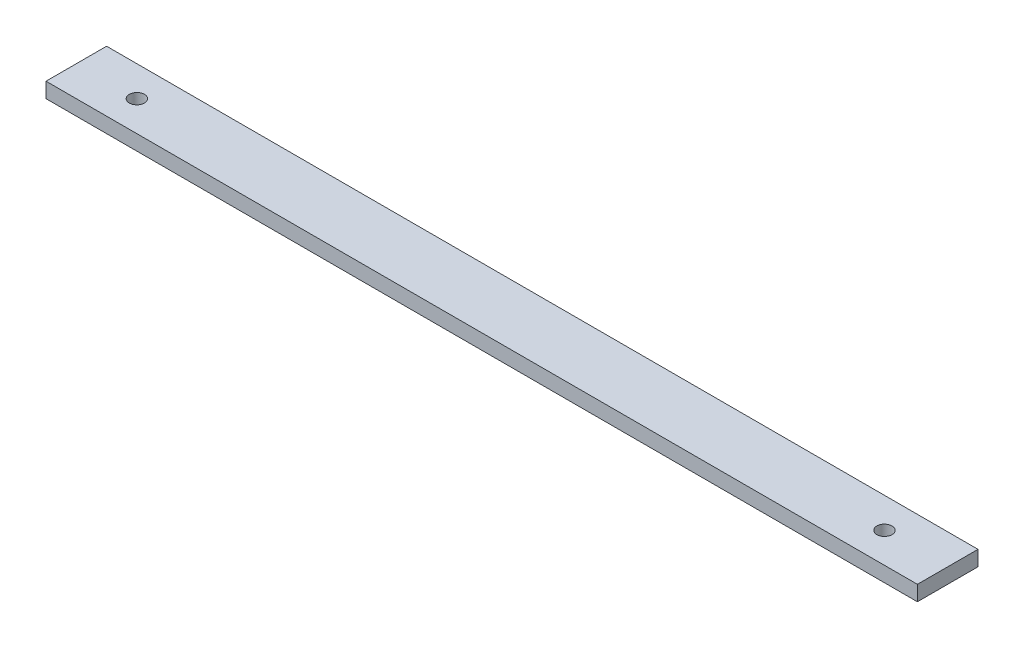
ISO-10303-21;
HEADER;
FILE_DESCRIPTION(('STEP AP214'),'2;1');
FILE_NAME('part.step','',(''),(''),'','','');
FILE_SCHEMA(('AUTOMOTIVE_DESIGN { 1 0 10303 214 1 1 1 1 }'));
ENDSEC;
DATA;
#1=APPLICATION_CONTEXT('core data for automotive mechanical design processes');
#2=APPLICATION_PROTOCOL_DEFINITION('international standard','automotive_design',2000,#1);
#3=PRODUCT_CONTEXT('',#1,'mechanical');
#4=PRODUCT('Part','Part','',(#3));
#5=PRODUCT_RELATED_PRODUCT_CATEGORY('part','',(#4));
#6=PRODUCT_DEFINITION_FORMATION('','',#4);
#7=PRODUCT_DEFINITION_CONTEXT('part definition',#1,'design');
#8=PRODUCT_DEFINITION('design','',#6,#7);
#9=PRODUCT_DEFINITION_SHAPE('','',#8);
#10=(LENGTH_UNIT() NAMED_UNIT(*) SI_UNIT(.MILLI.,.METRE.));
#11=(NAMED_UNIT(*) PLANE_ANGLE_UNIT() SI_UNIT($,.RADIAN.));
#12=(NAMED_UNIT(*) SI_UNIT($,.STERADIAN.) SOLID_ANGLE_UNIT());
#13=UNCERTAINTY_MEASURE_WITH_UNIT(LENGTH_MEASURE(1.E-05),#10,'distance_accuracy_value','');
#14=(GEOMETRIC_REPRESENTATION_CONTEXT(3) GLOBAL_UNCERTAINTY_ASSIGNED_CONTEXT((#13)) GLOBAL_UNIT_ASSIGNED_CONTEXT((#10,
#11,#12)) REPRESENTATION_CONTEXT('',''));
#15=CARTESIAN_POINT('',(0.,0.,0.));
#16=DIRECTION('',(0.,0.,1.));
#17=DIRECTION('',(1.,0.,0.));
#18=AXIS2_PLACEMENT_3D('',#15,#16,#17);
#19=CARTESIAN_POINT('',(0.,6.35,0.));
#20=DIRECTION('',(1.,0.,0.));
#21=DIRECTION('',(0.,0.,-1.));
#22=AXIS2_PLACEMENT_3D('',#19,#20,#21);
#23=PLANE('',#22);
#24=DIRECTION('',(0.,0.,1.));
#25=VECTOR('',#24,1.);
#26=CARTESIAN_POINT('',(0.,0.,0.));
#27=LINE('',#26,#25);
#28=CARTESIAN_POINT('',(0.,0.,0.));
#29=VERTEX_POINT('',#28);
#30=CARTESIAN_POINT('',(0.,0.,25.4));
#31=VERTEX_POINT('',#30);
#32=EDGE_CURVE('E96',#29,#31,#27,.T.);
#33=ORIENTED_EDGE('',*,*,#32,.T.);
#34=DIRECTION('',(0.,-1.,0.));
#35=VECTOR('',#34,1.);
#36=CARTESIAN_POINT('',(0.,6.35,25.4));
#37=LINE('',#36,#35);
#38=CARTESIAN_POINT('',(0.,6.35,25.4));
#39=VERTEX_POINT('',#38);
#40=EDGE_CURVE('E11',#39,#31,#37,.T.);
#41=ORIENTED_EDGE('',*,*,#40,.F.);
#42=DIRECTION('',(0.,0.,1.));
#43=VECTOR('',#42,1.);
#44=CARTESIAN_POINT('',(0.,6.35,0.));
#45=LINE('',#44,#43);
#46=CARTESIAN_POINT('',(0.,6.35,0.));
#47=VERTEX_POINT('',#46);
#48=EDGE_CURVE('E84',#47,#39,#45,.T.);
#49=ORIENTED_EDGE('',*,*,#48,.F.);
#50=DIRECTION('',(0.,-1.,0.));
#51=VECTOR('',#50,1.);
#52=CARTESIAN_POINT('',(0.,6.35,0.));
#53=LINE('',#52,#51);
#54=EDGE_CURVE('E92',#47,#29,#53,.T.);
#55=ORIENTED_EDGE('',*,*,#54,.T.);
#56=EDGE_LOOP('',(#33,#41,#49,#55));
#57=FACE_BOUND('',#56,.T.);
#58=ADVANCED_FACE('F33',(#57),#23,.F.);
#59=CARTESIAN_POINT('',(0.,6.35,25.4));
#60=DIRECTION('',(0.,0.,-1.));
#61=DIRECTION('',(-1.,0.,0.));
#62=AXIS2_PLACEMENT_3D('',#59,#60,#61);
#63=PLANE('',#62);
#64=DIRECTION('',(1.,0.,0.));
#65=VECTOR('',#64,1.);
#66=CARTESIAN_POINT('',(0.,0.,25.4));
#67=LINE('',#66,#65);
#68=CARTESIAN_POINT('',(365.252,0.,25.4));
#69=VERTEX_POINT('',#68);
#70=EDGE_CURVE('E88',#31,#69,#67,.T.);
#71=ORIENTED_EDGE('',*,*,#70,.T.);
#72=DIRECTION('',(0.,-1.,0.));
#73=VECTOR('',#72,1.);
#74=CARTESIAN_POINT('',(365.252,6.35,25.4));
#75=LINE('',#74,#73);
#76=CARTESIAN_POINT('',(365.252,6.35,25.4));
#77=VERTEX_POINT('',#76);
#78=EDGE_CURVE('E41',#77,#69,#75,.T.);
#79=ORIENTED_EDGE('',*,*,#78,.F.);
#80=DIRECTION('',(1.,0.,0.));
#81=VECTOR('',#80,1.);
#82=CARTESIAN_POINT('',(0.,6.35,25.4));
#83=LINE('',#82,#81);
#84=EDGE_CURVE('E79',#39,#77,#83,.T.);
#85=ORIENTED_EDGE('',*,*,#84,.F.);
#86=ORIENTED_EDGE('',*,*,#40,.T.);
#87=EDGE_LOOP('',(#71,#79,#85,#86));
#88=FACE_BOUND('',#87,.T.);
#89=ADVANCED_FACE('F87',(#88),#63,.F.);
#90=CARTESIAN_POINT('',(365.252,6.35,0.));
#91=DIRECTION('',(-1.,0.,0.));
#92=DIRECTION('',(0.,0.,1.));
#93=AXIS2_PLACEMENT_3D('',#90,#91,#92);
#94=PLANE('',#93);
#95=DIRECTION('',(0.,0.,-1.));
#96=VECTOR('',#95,1.);
#97=CARTESIAN_POINT('',(365.252,0.,0.));
#98=LINE('',#97,#96);
#99=CARTESIAN_POINT('',(365.252,0.,0.));
#100=VERTEX_POINT('',#99);
#101=EDGE_CURVE('E66',#69,#100,#98,.T.);
#102=ORIENTED_EDGE('',*,*,#101,.T.);
#103=DIRECTION('',(0.,-1.,0.));
#104=VECTOR('',#103,1.);
#105=CARTESIAN_POINT('',(365.252,6.35,0.));
#106=LINE('',#105,#104);
#107=CARTESIAN_POINT('',(365.252,6.35,0.));
#108=VERTEX_POINT('',#107);
#109=EDGE_CURVE('E89',#108,#100,#106,.T.);
#110=ORIENTED_EDGE('',*,*,#109,.F.);
#111=DIRECTION('',(0.,0.,-1.));
#112=VECTOR('',#111,1.);
#113=CARTESIAN_POINT('',(365.252,6.35,0.));
#114=LINE('',#113,#112);
#115=EDGE_CURVE('E82',#77,#108,#114,.T.);
#116=ORIENTED_EDGE('',*,*,#115,.F.);
#117=ORIENTED_EDGE('',*,*,#78,.T.);
#118=EDGE_LOOP('',(#102,#110,#116,#117));
#119=FACE_BOUND('',#118,.T.);
#120=ADVANCED_FACE('F90',(#119),#94,.F.);
#121=CARTESIAN_POINT('',(0.,6.35,0.));
#122=DIRECTION('',(0.,0.,1.));
#123=DIRECTION('',(1.,0.,0.));
#124=AXIS2_PLACEMENT_3D('',#121,#122,#123);
#125=PLANE('',#124);
#126=DIRECTION('',(-1.,0.,0.));
#127=VECTOR('',#126,1.);
#128=CARTESIAN_POINT('',(0.,0.,0.));
#129=LINE('',#128,#127);
#130=EDGE_CURVE('E72',#100,#29,#129,.T.);
#131=ORIENTED_EDGE('',*,*,#130,.T.);
#132=ORIENTED_EDGE('',*,*,#54,.F.);
#133=DIRECTION('',(-1.,0.,0.));
#134=VECTOR('',#133,1.);
#135=CARTESIAN_POINT('',(0.,6.35,0.));
#136=LINE('',#135,#134);
#137=EDGE_CURVE('E49',#108,#47,#136,.T.);
#138=ORIENTED_EDGE('',*,*,#137,.F.);
#139=ORIENTED_EDGE('',*,*,#109,.T.);
#140=EDGE_LOOP('',(#131,#132,#138,#139));
#141=FACE_BOUND('',#140,.T.);
#142=ADVANCED_FACE('F104',(#141),#125,.F.);
#143=CARTESIAN_POINT('',(0.,6.35,0.));
#144=DIRECTION('',(0.,1.,0.));
#145=DIRECTION('',(0.,0.,1.));
#146=AXIS2_PLACEMENT_3D('',#143,#144,#145);
#147=PLANE('',#146);
#148=CARTESIAN_POINT('',(338.738972,6.35,12.7));
#149=DIRECTION('',(0.,1.,0.));
#150=DIRECTION('',(0.,0.,1.));
#151=AXIS2_PLACEMENT_3D('',#148,#149,#150);
#152=CIRCLE('',#151,3.17499999999997);
#153=CARTESIAN_POINT('',(338.738972,6.35,15.875));
#154=VERTEX_POINT('',#153);
#155=EDGE_CURVE('E116',#154,#154,#152,.F.);
#156=ORIENTED_EDGE('',*,*,#155,.T.);
#157=EDGE_LOOP('',(#156));
#158=FACE_BOUND('',#157,.T.);
#159=CARTESIAN_POINT('',(25.4,6.35,12.7));
#160=DIRECTION('',(0.,1.,0.));
#161=DIRECTION('',(0.,0.,1.));
#162=AXIS2_PLACEMENT_3D('',#159,#160,#161);
#163=CIRCLE('',#162,3.175);
#164=CARTESIAN_POINT('',(25.4,6.35,15.875));
#165=VERTEX_POINT('',#164);
#166=EDGE_CURVE('E110',#165,#165,#163,.F.);
#167=ORIENTED_EDGE('',*,*,#166,.T.);
#168=EDGE_LOOP('',(#167));
#169=FACE_BOUND('',#168,.T.);
#170=ORIENTED_EDGE('',*,*,#48,.T.);
#171=ORIENTED_EDGE('',*,*,#84,.T.);
#172=ORIENTED_EDGE('',*,*,#115,.T.);
#173=ORIENTED_EDGE('',*,*,#137,.T.);
#174=EDGE_LOOP('',(#170,#171,#172,#173));
#175=FACE_BOUND('',#174,.T.);
#176=ADVANCED_FACE('F80',(#158,#169,#175),#147,.T.);
#177=CARTESIAN_POINT('',(0.,0.,0.));
#178=DIRECTION('',(0.,1.,0.));
#179=DIRECTION('',(0.,0.,1.));
#180=AXIS2_PLACEMENT_3D('',#177,#178,#179);
#181=PLANE('',#180);
#182=CARTESIAN_POINT('',(338.738972,0.,12.7));
#183=DIRECTION('',(0.,-1.,0.));
#184=DIRECTION('',(0.,0.,-1.));
#185=AXIS2_PLACEMENT_3D('',#182,#183,#184);
#186=CIRCLE('',#185,3.17499999999997);
#187=CARTESIAN_POINT('',(338.738972,0.,9.52500000000003));
#188=VERTEX_POINT('',#187);
#189=EDGE_CURVE('E113',#188,#188,#186,.T.);
#190=ORIENTED_EDGE('',*,*,#189,.F.);
#191=EDGE_LOOP('',(#190));
#192=FACE_BOUND('',#191,.T.);
#193=CARTESIAN_POINT('',(25.4,0.,12.7));
#194=DIRECTION('',(0.,-1.,0.));
#195=DIRECTION('',(0.,0.,-1.));
#196=AXIS2_PLACEMENT_3D('',#193,#194,#195);
#197=CIRCLE('',#196,3.175);
#198=CARTESIAN_POINT('',(25.4,0.,9.525));
#199=VERTEX_POINT('',#198);
#200=EDGE_CURVE('E99',#199,#199,#197,.T.);
#201=ORIENTED_EDGE('',*,*,#200,.F.);
#202=EDGE_LOOP('',(#201));
#203=FACE_BOUND('',#202,.T.);
#204=ORIENTED_EDGE('',*,*,#32,.F.);
#205=ORIENTED_EDGE('',*,*,#130,.F.);
#206=ORIENTED_EDGE('',*,*,#101,.F.);
#207=ORIENTED_EDGE('',*,*,#70,.F.);
#208=EDGE_LOOP('',(#204,#205,#206,#207));
#209=FACE_BOUND('',#208,.T.);
#210=ADVANCED_FACE('F107',(#192,#203,#209),#181,.F.);
#211=CARTESIAN_POINT('',(25.4,6.351,12.7));
#212=DIRECTION('',(0.,-1.,0.));
#213=DIRECTION('',(0.,0.,-1.));
#214=AXIS2_PLACEMENT_3D('',#211,#212,#213);
#215=CYLINDRICAL_SURFACE('',#214,3.175);
#216=ORIENTED_EDGE('',*,*,#166,.F.);
#217=EDGE_LOOP('',(#216));
#218=FACE_BOUND('',#217,.T.);
#219=ORIENTED_EDGE('',*,*,#200,.T.);
#220=EDGE_LOOP('',(#219));
#221=FACE_BOUND('',#220,.T.);
#222=ADVANCED_FACE('F126',(#218,#221),#215,.F.);
#223=CARTESIAN_POINT('',(338.738972,6.351,12.7));
#224=DIRECTION('',(0.,-1.,0.));
#225=DIRECTION('',(0.,0.,-1.));
#226=AXIS2_PLACEMENT_3D('',#223,#224,#225);
#227=CYLINDRICAL_SURFACE('',#226,3.17499999999997);
#228=ORIENTED_EDGE('',*,*,#155,.F.);
#229=EDGE_LOOP('',(#228));
#230=FACE_BOUND('',#229,.T.);
#231=ORIENTED_EDGE('',*,*,#189,.T.);
#232=EDGE_LOOP('',(#231));
#233=FACE_BOUND('',#232,.T.);
#234=ADVANCED_FACE('F122',(#230,#233),#227,.F.);
#235=CLOSED_SHELL('',(#58,#89,#120,#142,#176,#210,#222,#234));
#236=MANIFOLD_SOLID_BREP('B2',#235);
#237=ADVANCED_BREP_SHAPE_REPRESENTATION('',(#18,#236),#14);
#238=SHAPE_DEFINITION_REPRESENTATION(#9,#237);
ENDSEC;
END-ISO-10303-21;
